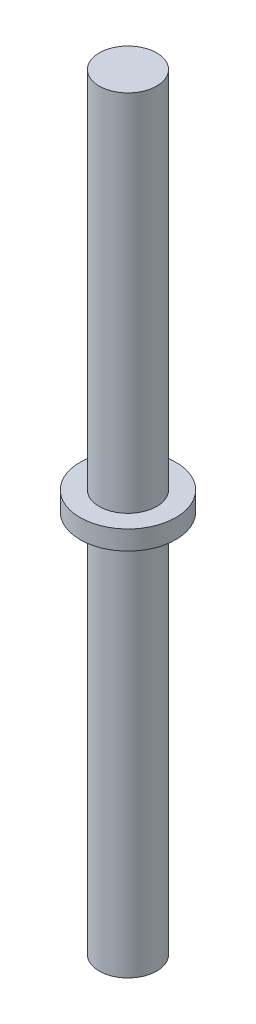
ISO-10303-21;
HEADER;
FILE_DESCRIPTION(('STEP AP214'),'2;1');
FILE_NAME('part.step','',(''),(''),'','','');
FILE_SCHEMA(('AUTOMOTIVE_DESIGN { 1 0 10303 214 1 1 1 1 }'));
ENDSEC;
DATA;
#1=APPLICATION_CONTEXT('core data for automotive mechanical design processes');
#2=APPLICATION_PROTOCOL_DEFINITION('international standard','automotive_design',2000,#1);
#3=PRODUCT_CONTEXT('',#1,'mechanical');
#4=PRODUCT('Part','Part','',(#3));
#5=PRODUCT_RELATED_PRODUCT_CATEGORY('part','',(#4));
#6=PRODUCT_DEFINITION_FORMATION('','',#4);
#7=PRODUCT_DEFINITION_CONTEXT('part definition',#1,'design');
#8=PRODUCT_DEFINITION('design','',#6,#7);
#9=PRODUCT_DEFINITION_SHAPE('','',#8);
#10=(LENGTH_UNIT() NAMED_UNIT(*) SI_UNIT(.MILLI.,.METRE.));
#11=(NAMED_UNIT(*) PLANE_ANGLE_UNIT() SI_UNIT($,.RADIAN.));
#12=(NAMED_UNIT(*) SI_UNIT($,.STERADIAN.) SOLID_ANGLE_UNIT());
#13=UNCERTAINTY_MEASURE_WITH_UNIT(LENGTH_MEASURE(1.E-05),#10,'distance_accuracy_value','');
#14=(GEOMETRIC_REPRESENTATION_CONTEXT(3) GLOBAL_UNCERTAINTY_ASSIGNED_CONTEXT((#13)) GLOBAL_UNIT_ASSIGNED_CONTEXT((#10,
#11,#12)) REPRESENTATION_CONTEXT('',''));
#15=CARTESIAN_POINT('',(0.,0.,0.));
#16=DIRECTION('',(0.,0.,1.));
#17=DIRECTION('',(1.,0.,0.));
#18=AXIS2_PLACEMENT_3D('',#15,#16,#17);
#19=CARTESIAN_POINT('',(0.,200.,0.));
#20=DIRECTION('',(0.,-1.,0.));
#21=DIRECTION('',(0.,0.,-1.));
#22=AXIS2_PLACEMENT_3D('',#19,#20,#21);
#23=CYLINDRICAL_SURFACE('',#22,7.5);
#24=CARTESIAN_POINT('',(0.,105.,0.));
#25=DIRECTION('',(0.,1.,0.));
#26=DIRECTION('',(0.,0.,1.));
#27=AXIS2_PLACEMENT_3D('',#24,#25,#26);
#28=CIRCLE('',#27,7.5);
#29=CARTESIAN_POINT('',(0.,105.,7.5));
#30=VERTEX_POINT('',#29);
#31=EDGE_CURVE('E34',#30,#30,#28,.T.);
#32=ORIENTED_EDGE('',*,*,#31,.T.);
#33=EDGE_LOOP('',(#32));
#34=FACE_BOUND('',#33,.T.);
#35=CARTESIAN_POINT('',(0.,200.,0.));
#36=DIRECTION('',(0.,1.,0.));
#37=DIRECTION('',(0.,0.,1.));
#38=AXIS2_PLACEMENT_3D('',#35,#36,#37);
#39=CIRCLE('',#38,7.5);
#40=CARTESIAN_POINT('',(0.,200.,7.5));
#41=VERTEX_POINT('',#40);
#42=EDGE_CURVE('E38',#41,#41,#39,.T.);
#43=ORIENTED_EDGE('',*,*,#42,.F.);
#44=EDGE_LOOP('',(#43));
#45=FACE_BOUND('',#44,.T.);
#46=ADVANCED_FACE('F31',(#34,#45),#23,.T.);
#47=CARTESIAN_POINT('',(0.,200.,0.));
#48=DIRECTION('',(0.,1.,0.));
#49=DIRECTION('',(0.,0.,1.));
#50=AXIS2_PLACEMENT_3D('',#47,#48,#49);
#51=PLANE('',#50);
#52=ORIENTED_EDGE('',*,*,#42,.T.);
#53=EDGE_LOOP('',(#52));
#54=FACE_BOUND('',#53,.T.);
#55=ADVANCED_FACE('F70',(#54),#51,.T.);
#56=CARTESIAN_POINT('',(0.,105.,0.));
#57=DIRECTION('',(0.,-1.,0.));
#58=DIRECTION('',(0.,0.,-1.));
#59=AXIS2_PLACEMENT_3D('',#56,#57,#58);
#60=CYLINDRICAL_SURFACE('',#59,12.5);
#61=CARTESIAN_POINT('',(0.,105.,0.));
#62=DIRECTION('',(0.,1.,0.));
#63=DIRECTION('',(0.,0.,1.));
#64=AXIS2_PLACEMENT_3D('',#61,#62,#63);
#65=CIRCLE('',#64,12.5);
#66=CARTESIAN_POINT('',(0.,105.,12.5));
#67=VERTEX_POINT('',#66);
#68=EDGE_CURVE('E50',#67,#67,#65,.T.);
#69=ORIENTED_EDGE('',*,*,#68,.F.);
#70=EDGE_LOOP('',(#69));
#71=FACE_BOUND('',#70,.T.);
#72=CARTESIAN_POINT('',(0.,100.,0.));
#73=DIRECTION('',(0.,1.,0.));
#74=DIRECTION('',(0.,0.,1.));
#75=AXIS2_PLACEMENT_3D('',#72,#73,#74);
#76=CIRCLE('',#75,12.5);
#77=CARTESIAN_POINT('',(0.,100.,12.5));
#78=VERTEX_POINT('',#77);
#79=EDGE_CURVE('E47',#78,#78,#76,.T.);
#80=ORIENTED_EDGE('',*,*,#79,.T.);
#81=EDGE_LOOP('',(#80));
#82=FACE_BOUND('',#81,.T.);
#83=ADVANCED_FACE('F62',(#71,#82),#60,.T.);
#84=CARTESIAN_POINT('',(0.,105.,0.));
#85=DIRECTION('',(0.,1.,0.));
#86=DIRECTION('',(0.,0.,1.));
#87=AXIS2_PLACEMENT_3D('',#84,#85,#86);
#88=PLANE('',#87);
#89=ORIENTED_EDGE('',*,*,#31,.F.);
#90=EDGE_LOOP('',(#89));
#91=FACE_BOUND('',#90,.T.);
#92=ORIENTED_EDGE('',*,*,#68,.T.);
#93=EDGE_LOOP('',(#92));
#94=FACE_BOUND('',#93,.T.);
#95=ADVANCED_FACE('F59',(#91,#94),#88,.T.);
#96=CARTESIAN_POINT('',(0.,100.,0.));
#97=DIRECTION('',(0.,1.,0.));
#98=DIRECTION('',(0.,0.,1.));
#99=AXIS2_PLACEMENT_3D('',#96,#97,#98);
#100=PLANE('',#99);
#101=CARTESIAN_POINT('',(0.,100.,0.));
#102=DIRECTION('',(0.,1.,0.));
#103=DIRECTION('',(0.,0.,1.));
#104=AXIS2_PLACEMENT_3D('',#101,#102,#103);
#105=CIRCLE('',#104,7.5);
#106=CARTESIAN_POINT('',(0.,100.,7.5));
#107=VERTEX_POINT('',#106);
#108=EDGE_CURVE('E10',#107,#107,#105,.T.);
#109=ORIENTED_EDGE('',*,*,#108,.T.);
#110=EDGE_LOOP('',(#109));
#111=FACE_BOUND('',#110,.T.);
#112=ORIENTED_EDGE('',*,*,#79,.F.);
#113=EDGE_LOOP('',(#112));
#114=FACE_BOUND('',#113,.T.);
#115=ADVANCED_FACE('F61',(#111,#114),#100,.F.);
#116=CARTESIAN_POINT('',(0.,0.,0.));
#117=DIRECTION('',(0.,1.,0.));
#118=DIRECTION('',(0.,0.,1.));
#119=AXIS2_PLACEMENT_3D('',#116,#117,#118);
#120=PLANE('',#119);
#121=CARTESIAN_POINT('',(0.,0.,0.));
#122=DIRECTION('',(0.,1.,0.));
#123=DIRECTION('',(0.,0.,1.));
#124=AXIS2_PLACEMENT_3D('',#121,#122,#123);
#125=CIRCLE('',#124,7.5);
#126=CARTESIAN_POINT('',(0.,0.,7.5));
#127=VERTEX_POINT('',#126);
#128=EDGE_CURVE('E42',#127,#127,#125,.T.);
#129=ORIENTED_EDGE('',*,*,#128,.F.);
#130=EDGE_LOOP('',(#129));
#131=FACE_BOUND('',#130,.T.);
#132=ADVANCED_FACE('F68',(#131),#120,.F.);
#133=ORIENTED_EDGE('',*,*,#128,.T.);
#134=EDGE_LOOP('',(#133));
#135=FACE_BOUND('',#134,.T.);
#136=ORIENTED_EDGE('',*,*,#108,.F.);
#137=EDGE_LOOP('',(#136));
#138=FACE_BOUND('',#137,.T.);
#139=ADVANCED_FACE('F74',(#135,#138),#23,.T.);
#140=CLOSED_SHELL('',(#46,#55,#83,#95,#115,#132,#139));
#141=MANIFOLD_SOLID_BREP('B2',#140);
#142=ADVANCED_BREP_SHAPE_REPRESENTATION('',(#18,#141),#14);
#143=SHAPE_DEFINITION_REPRESENTATION(#9,#142);
ENDSEC;
END-ISO-10303-21;
